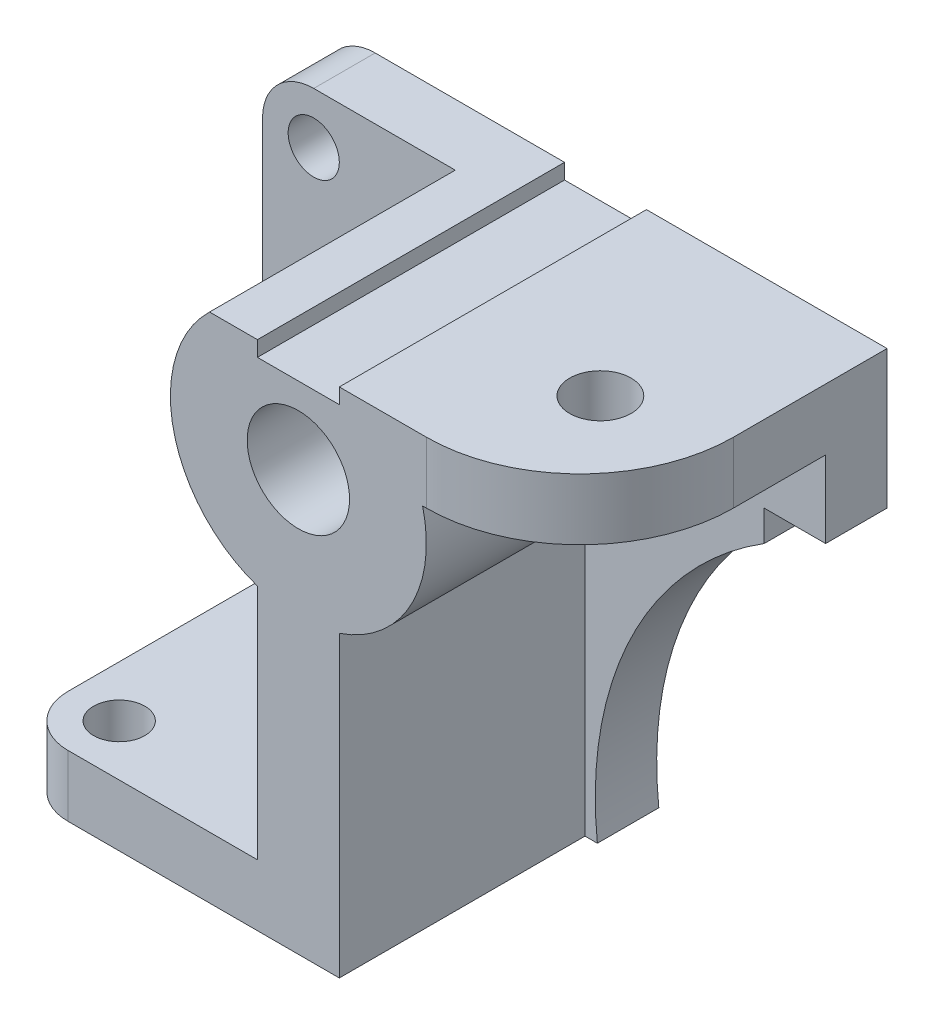
ISO-10303-21;
HEADER;
FILE_DESCRIPTION(('STEP AP214'),'2;1');
FILE_NAME('part.step','',(''),(''),'','','');
FILE_SCHEMA(('AUTOMOTIVE_DESIGN { 1 0 10303 214 1 1 1 1 }'));
ENDSEC;
DATA;
#1=APPLICATION_CONTEXT('core data for automotive mechanical design processes');
#2=APPLICATION_PROTOCOL_DEFINITION('international standard','automotive_design',2000,#1);
#3=PRODUCT_CONTEXT('',#1,'mechanical');
#4=PRODUCT('Part','Part','',(#3));
#5=PRODUCT_RELATED_PRODUCT_CATEGORY('part','',(#4));
#6=PRODUCT_DEFINITION_FORMATION('','',#4);
#7=PRODUCT_DEFINITION_CONTEXT('part definition',#1,'design');
#8=PRODUCT_DEFINITION('design','',#6,#7);
#9=PRODUCT_DEFINITION_SHAPE('','',#8);
#10=(LENGTH_UNIT() NAMED_UNIT(*) SI_UNIT(.MILLI.,.METRE.));
#11=(NAMED_UNIT(*) PLANE_ANGLE_UNIT() SI_UNIT($,.RADIAN.));
#12=(NAMED_UNIT(*) SI_UNIT($,.STERADIAN.) SOLID_ANGLE_UNIT());
#13=UNCERTAINTY_MEASURE_WITH_UNIT(LENGTH_MEASURE(1.E-05),#10,'distance_accuracy_value','');
#14=(GEOMETRIC_REPRESENTATION_CONTEXT(3) GLOBAL_UNCERTAINTY_ASSIGNED_CONTEXT((#13)) GLOBAL_UNIT_ASSIGNED_CONTEXT((#10,
#11,#12)) REPRESENTATION_CONTEXT('',''));
#15=CARTESIAN_POINT('',(0.,0.,0.));
#16=DIRECTION('',(0.,0.,1.));
#17=DIRECTION('',(1.,0.,0.));
#18=AXIS2_PLACEMENT_3D('',#15,#16,#17);
#19=CARTESIAN_POINT('',(-55.,50.,30.));
#20=DIRECTION('',(0.,-1.,0.));
#21=DIRECTION('',(0.,0.,-1.));
#22=AXIS2_PLACEMENT_3D('',#19,#20,#21);
#23=PLANE('',#22);
#24=CARTESIAN_POINT('',(35.,50.,6.));
#25=DIRECTION('',(0.,1.,0.));
#26=DIRECTION('',(0.,0.,1.));
#27=AXIS2_PLACEMENT_3D('',#24,#25,#26);
#28=CIRCLE('',#27,6.00000000000001);
#29=CARTESIAN_POINT('',(35.,50.,12.));
#30=VERTEX_POINT('',#29);
#31=EDGE_CURVE('E380',#30,#30,#28,.T.);
#32=ORIENTED_EDGE('',*,*,#31,.F.);
#33=EDGE_LOOP('',(#32));
#34=FACE_BOUND('',#33,.T.);
#35=DIRECTION('',(-1.,0.,0.));
#36=VECTOR('',#35,1.);
#37=CARTESIAN_POINT('',(-55.,50.,-30.));
#38=LINE('',#37,#36);
#39=CARTESIAN_POINT('',(55.,50.,-30.));
#40=VERTEX_POINT('',#39);
#41=CARTESIAN_POINT('',(8.,50.,-30.));
#42=VERTEX_POINT('',#41);
#43=EDGE_CURVE('E206',#40,#42,#38,.T.);
#44=ORIENTED_EDGE('',*,*,#43,.T.);
#45=DIRECTION('',(0.,0.,1.));
#46=VECTOR('',#45,1.);
#47=CARTESIAN_POINT('',(8.,50.,-30.));
#48=LINE('',#47,#46);
#49=CARTESIAN_POINT('',(8.,50.,30.));
#50=VERTEX_POINT('',#49);
#51=EDGE_CURVE('E190',#42,#50,#48,.T.);
#52=ORIENTED_EDGE('',*,*,#51,.T.);
#53=DIRECTION('',(-1.,0.,0.));
#54=VECTOR('',#53,1.);
#55=CARTESIAN_POINT('',(-55.,50.,30.));
#56=LINE('',#55,#54);
#57=CARTESIAN_POINT('',(25.,50.,30.));
#58=VERTEX_POINT('',#57);
#59=EDGE_CURVE('E253',#58,#50,#56,.T.);
#60=ORIENTED_EDGE('',*,*,#59,.F.);
#61=CARTESIAN_POINT('',(25.,50.,0.));
#62=DIRECTION('',(0.,-1.,0.));
#63=DIRECTION('',(0.,0.,-1.));
#64=AXIS2_PLACEMENT_3D('',#61,#62,#63);
#65=CIRCLE('',#64,30.);
#66=CARTESIAN_POINT('',(55.,50.,0.));
#67=VERTEX_POINT('',#66);
#68=EDGE_CURVE('E252',#58,#67,#65,.F.);
#69=ORIENTED_EDGE('',*,*,#68,.T.);
#70=DIRECTION('',(0.,0.,-1.));
#71=VECTOR('',#70,1.);
#72=CARTESIAN_POINT('',(55.,50.,30.));
#73=LINE('',#72,#71);
#74=EDGE_CURVE('E211',#67,#40,#73,.T.);
#75=ORIENTED_EDGE('',*,*,#74,.T.);
#76=EDGE_LOOP('',(#44,#52,#60,#69,#75));
#77=FACE_BOUND('',#76,.T.);
#78=ADVANCED_FACE('F41',(#34,#77),#23,.F.);
#79=CARTESIAN_POINT('',(-8.00000000000001,-38.,-18.));
#80=DIRECTION('',(0.,-1.,0.));
#81=DIRECTION('',(0.,0.,-1.));
#82=AXIS2_PLACEMENT_3D('',#79,#80,#81);
#83=PLANE('',#82);
#84=DIRECTION('',(0.,0.,1.));
#85=VECTOR('',#84,1.);
#86=CARTESIAN_POINT('',(-55.,-38.,-18.));
#87=LINE('',#86,#85);
#88=CARTESIAN_POINT('',(-55.,-38.,-18.));
#89=VERTEX_POINT('',#88);
#90=CARTESIAN_POINT('',(-55.,-38.,20.));
#91=VERTEX_POINT('',#90);
#92=EDGE_CURVE('E335',#89,#91,#87,.T.);
#93=ORIENTED_EDGE('',*,*,#92,.T.);
#94=CARTESIAN_POINT('',(-45.,-38.,20.));
#95=DIRECTION('',(0.,-1.,0.));
#96=DIRECTION('',(0.,0.,-1.));
#97=AXIS2_PLACEMENT_3D('',#94,#95,#96);
#98=CIRCLE('',#97,10.);
#99=CARTESIAN_POINT('',(-45.,-38.,30.));
#100=VERTEX_POINT('',#99);
#101=EDGE_CURVE('E247',#91,#100,#98,.F.);
#102=ORIENTED_EDGE('',*,*,#101,.T.);
#103=DIRECTION('',(1.,0.,0.));
#104=VECTOR('',#103,1.);
#105=CARTESIAN_POINT('',(-8.00000000000001,-38.,30.));
#106=LINE('',#105,#104);
#107=CARTESIAN_POINT('',(-8.00000000000001,-38.,30.));
#108=VERTEX_POINT('',#107);
#109=EDGE_CURVE('E326',#100,#108,#106,.T.);
#110=ORIENTED_EDGE('',*,*,#109,.T.);
#111=DIRECTION('',(0.,0.,1.));
#112=VECTOR('',#111,1.);
#113=CARTESIAN_POINT('',(-8.00000000000001,-38.,-18.));
#114=LINE('',#113,#112);
#115=CARTESIAN_POINT('',(-8.00000000000001,-38.,-18.));
#116=VERTEX_POINT('',#115);
#117=EDGE_CURVE('E332',#116,#108,#114,.T.);
#118=ORIENTED_EDGE('',*,*,#117,.F.);
#119=DIRECTION('',(1.,0.,0.));
#120=VECTOR('',#119,1.);
#121=CARTESIAN_POINT('',(-8.00000000000001,-38.,-18.));
#122=LINE('',#121,#120);
#123=EDGE_CURVE('E317',#89,#116,#122,.T.);
#124=ORIENTED_EDGE('',*,*,#123,.F.);
#125=EDGE_LOOP('',(#93,#102,#110,#118,#124));
#126=FACE_BOUND('',#125,.T.);
#127=CARTESIAN_POINT('',(-45.,-38.,20.));
#128=DIRECTION('',(0.,1.,0.));
#129=DIRECTION('',(0.,0.,1.));
#130=AXIS2_PLACEMENT_3D('',#127,#128,#129);
#131=CIRCLE('',#130,5.00000000000001);
#132=CARTESIAN_POINT('',(-45.,-38.,25.));
#133=VERTEX_POINT('',#132);
#134=EDGE_CURVE('E386',#133,#133,#131,.T.);
#135=ORIENTED_EDGE('',*,*,#134,.F.);
#136=EDGE_LOOP('',(#135));
#137=FACE_BOUND('',#136,.T.);
#138=ADVANCED_FACE('F466',(#126,#137),#83,.F.);
#139=CARTESIAN_POINT('',(-8.,50.,30.));
#140=VERTEX_POINT('',#139);
#141=CARTESIAN_POINT('',(-17.3493515728975,50.,30.));
#142=VERTEX_POINT('',#141);
#143=EDGE_CURVE('E225',#140,#142,#56,.T.);
#144=ORIENTED_EDGE('',*,*,#143,.F.);
#145=DIRECTION('',(0.,0.,1.));
#146=VECTOR('',#145,1.);
#147=CARTESIAN_POINT('',(-8.,50.,-30.));
#148=LINE('',#147,#146);
#149=CARTESIAN_POINT('',(-8.,50.,-30.));
#150=VERTEX_POINT('',#149);
#151=EDGE_CURVE('E200',#150,#140,#148,.T.);
#152=ORIENTED_EDGE('',*,*,#151,.F.);
#153=CARTESIAN_POINT('',(-45.,50.,-30.));
#154=VERTEX_POINT('',#153);
#155=EDGE_CURVE('E214',#150,#154,#38,.T.);
#156=ORIENTED_EDGE('',*,*,#155,.T.);
#157=DIRECTION('',(0.,0.,-1.));
#158=VECTOR('',#157,1.);
#159=CARTESIAN_POINT('',(-45.,50.,30.));
#160=LINE('',#159,#158);
#161=CARTESIAN_POINT('',(-45.,50.,-18.));
#162=VERTEX_POINT('',#161);
#163=EDGE_CURVE('E238',#154,#162,#160,.F.);
#164=ORIENTED_EDGE('',*,*,#163,.T.);
#165=DIRECTION('',(-1.,0.,0.));
#166=VECTOR('',#165,1.);
#167=CARTESIAN_POINT('',(-17.3493515728975,50.,-18.));
#168=LINE('',#167,#166);
#169=CARTESIAN_POINT('',(-17.3493515728975,50.,-18.));
#170=VERTEX_POINT('',#169);
#171=EDGE_CURVE('E311',#170,#162,#168,.T.);
#172=ORIENTED_EDGE('',*,*,#171,.F.);
#173=DIRECTION('',(0.,0.,1.));
#174=VECTOR('',#173,1.);
#175=CARTESIAN_POINT('',(-17.3493515728975,50.,-18.));
#176=LINE('',#175,#174);
#177=EDGE_CURVE('E323',#170,#142,#176,.T.);
#178=ORIENTED_EDGE('',*,*,#177,.T.);
#179=EDGE_LOOP('',(#144,#152,#156,#164,#172,#178));
#180=FACE_BOUND('',#179,.T.);
#181=ADVANCED_FACE('F414',(#180),#23,.F.);
#182=CARTESIAN_POINT('',(43.,23.,-30.));
#183=DIRECTION('',(-1.,0.,0.));
#184=DIRECTION('',(0.,0.,1.));
#185=AXIS2_PLACEMENT_3D('',#182,#183,#184);
#186=PLANE('',#185);
#187=DIRECTION('',(0.,1.,0.));
#188=VECTOR('',#187,1.);
#189=CARTESIAN_POINT('',(43.,23.,-18.));
#190=LINE('',#189,#188);
#191=CARTESIAN_POINT('',(43.,17.,-18.));
#192=VERTEX_POINT('',#191);
#193=CARTESIAN_POINT('',(43.,23.,-18.));
#194=VERTEX_POINT('',#193);
#195=EDGE_CURVE('E280',#192,#194,#190,.T.);
#196=ORIENTED_EDGE('',*,*,#195,.F.);
#197=DIRECTION('',(0.,0.,1.));
#198=VECTOR('',#197,1.);
#199=CARTESIAN_POINT('',(43.,17.,-30.));
#200=LINE('',#199,#198);
#201=CARTESIAN_POINT('',(43.,17.,-30.));
#202=VERTEX_POINT('',#201);
#203=EDGE_CURVE('E299',#202,#192,#200,.T.);
#204=ORIENTED_EDGE('',*,*,#203,.F.);
#205=DIRECTION('',(0.,-1.,0.));
#206=VECTOR('',#205,1.);
#207=CARTESIAN_POINT('',(43.,23.,-30.));
#208=LINE('',#207,#206);
#209=CARTESIAN_POINT('',(43.,23.,-30.));
#210=VERTEX_POINT('',#209);
#211=EDGE_CURVE('E289',#210,#202,#208,.T.);
#212=ORIENTED_EDGE('',*,*,#211,.F.);
#213=DIRECTION('',(0.,0.,1.));
#214=VECTOR('',#213,1.);
#215=CARTESIAN_POINT('',(43.,23.,-30.));
#216=LINE('',#215,#214);
#217=EDGE_CURVE('E300',#210,#194,#216,.T.);
#218=ORIENTED_EDGE('',*,*,#217,.T.);
#219=EDGE_LOOP('',(#196,#204,#212,#218));
#220=FACE_BOUND('',#219,.T.);
#221=ADVANCED_FACE('F445',(#220),#186,.F.);
#222=CARTESIAN_POINT('',(43.,23.,-30.));
#223=DIRECTION('',(0.,-1.,0.));
#224=DIRECTION('',(0.,0.,-1.));
#225=AXIS2_PLACEMENT_3D('',#222,#223,#224);
#226=PLANE('',#225);
#227=DIRECTION('',(0.,0.,1.));
#228=VECTOR('',#227,1.);
#229=CARTESIAN_POINT('',(55.,23.,-30.));
#230=LINE('',#229,#228);
#231=CARTESIAN_POINT('',(55.,23.,-30.));
#232=VERTEX_POINT('',#231);
#233=CARTESIAN_POINT('',(55.,23.,-18.));
#234=VERTEX_POINT('',#233);
#235=EDGE_CURVE('E304',#232,#234,#230,.T.);
#236=ORIENTED_EDGE('',*,*,#235,.T.);
#237=DIRECTION('',(1.,0.,0.));
#238=VECTOR('',#237,1.);
#239=CARTESIAN_POINT('',(43.,23.,-18.));
#240=LINE('',#239,#238);
#241=EDGE_CURVE('E285',#194,#234,#240,.T.);
#242=ORIENTED_EDGE('',*,*,#241,.F.);
#243=ORIENTED_EDGE('',*,*,#217,.F.);
#244=DIRECTION('',(1.,0.,0.));
#245=VECTOR('',#244,1.);
#246=CARTESIAN_POINT('',(43.,23.,-30.));
#247=LINE('',#246,#245);
#248=EDGE_CURVE('E297',#210,#232,#247,.T.);
#249=ORIENTED_EDGE('',*,*,#248,.T.);
#250=EDGE_LOOP('',(#236,#242,#243,#249));
#251=FACE_BOUND('',#250,.T.);
#252=ADVANCED_FACE('F450',(#251),#226,.T.);
#253=CARTESIAN_POINT('',(55.,50.,30.));
#254=DIRECTION('',(-1.,0.,0.));
#255=DIRECTION('',(0.,-1.,0.));
#256=AXIS2_PLACEMENT_3D('',#253,#254,#255);
#257=PLANE('',#256);
#258=ORIENTED_EDGE('',*,*,#74,.F.);
#259=DIRECTION('',(0.,1.,0.));
#260=VECTOR('',#259,1.);
#261=CARTESIAN_POINT('',(55.,38.,0.));
#262=LINE('',#261,#260);
#263=CARTESIAN_POINT('',(55.,38.,0.));
#264=VERTEX_POINT('',#263);
#265=EDGE_CURVE('E49',#67,#264,#262,.F.);
#266=ORIENTED_EDGE('',*,*,#265,.T.);
#267=DIRECTION('',(0.,0.,1.));
#268=VECTOR('',#267,1.);
#269=CARTESIAN_POINT('',(55.,38.,-18.));
#270=LINE('',#269,#268);
#271=CARTESIAN_POINT('',(55.,38.,-18.));
#272=VERTEX_POINT('',#271);
#273=EDGE_CURVE('E264',#272,#264,#270,.T.);
#274=ORIENTED_EDGE('',*,*,#273,.F.);
#275=DIRECTION('',(0.,1.,0.));
#276=VECTOR('',#275,1.);
#277=CARTESIAN_POINT('',(55.,23.,-18.));
#278=LINE('',#277,#276);
#279=EDGE_CURVE('E365',#234,#272,#278,.T.);
#280=ORIENTED_EDGE('',*,*,#279,.F.);
#281=ORIENTED_EDGE('',*,*,#235,.F.);
#282=DIRECTION('',(0.,1.,0.));
#283=VECTOR('',#282,1.);
#284=CARTESIAN_POINT('',(55.,50.,-30.));
#285=LINE('',#284,#283);
#286=EDGE_CURVE('E219',#232,#40,#285,.T.);
#287=ORIENTED_EDGE('',*,*,#286,.T.);
#288=EDGE_LOOP('',(#258,#266,#274,#280,#281,#287));
#289=FACE_BOUND('',#288,.T.);
#290=ADVANCED_FACE('F256',(#289),#257,.F.);
#291=CARTESIAN_POINT('',(0.,0.,30.));
#292=DIRECTION('',(0.,0.,1.));
#293=DIRECTION('',(1.,0.,0.));
#294=AXIS2_PLACEMENT_3D('',#291,#292,#293);
#295=PLANE('',#294);
#296=DIRECTION('',(0.,1.,0.));
#297=VECTOR('',#296,1.);
#298=CARTESIAN_POINT('',(8.,47.,30.));
#299=LINE('',#298,#297);
#300=CARTESIAN_POINT('',(8.,47.,30.));
#301=VERTEX_POINT('',#300);
#302=EDGE_CURVE('E195',#301,#50,#299,.T.);
#303=ORIENTED_EDGE('',*,*,#302,.F.);
#304=DIRECTION('',(1.,0.,0.));
#305=VECTOR('',#304,1.);
#306=CARTESIAN_POINT('',(-8.,47.,30.));
#307=LINE('',#306,#305);
#308=CARTESIAN_POINT('',(-8.,47.,30.));
#309=VERTEX_POINT('',#308);
#310=EDGE_CURVE('E209',#309,#301,#307,.T.);
#311=ORIENTED_EDGE('',*,*,#310,.F.);
#312=DIRECTION('',(0.,-1.,0.));
#313=VECTOR('',#312,1.);
#314=CARTESIAN_POINT('',(-8.,47.,30.));
#315=LINE('',#314,#313);
#316=EDGE_CURVE('E402',#140,#309,#315,.T.);
#317=ORIENTED_EDGE('',*,*,#316,.F.);
#318=ORIENTED_EDGE('',*,*,#143,.T.);
#319=CARTESIAN_POINT('',(0.,32.,30.));
#320=DIRECTION('',(0.,0.,-1.));
#321=DIRECTION('',(1.,0.,0.));
#322=AXIS2_PLACEMENT_3D('',#319,#320,#321);
#323=CIRCLE('',#322,25.);
#324=CARTESIAN_POINT('',(-8.00000000000002,8.31456143534599,30.));
#325=VERTEX_POINT('',#324);
#326=EDGE_CURVE('E303',#325,#142,#323,.T.);
#327=ORIENTED_EDGE('',*,*,#326,.F.);
#328=DIRECTION('',(0.,1.,0.));
#329=VECTOR('',#328,1.);
#330=CARTESIAN_POINT('',(-8.00000000000002,8.31456143534599,30.));
#331=LINE('',#330,#329);
#332=EDGE_CURVE('E312',#108,#325,#331,.T.);
#333=ORIENTED_EDGE('',*,*,#332,.F.);
#334=ORIENTED_EDGE('',*,*,#109,.F.);
#335=DIRECTION('',(0.,-1.,0.));
#336=VECTOR('',#335,1.);
#337=CARTESIAN_POINT('',(-45.,-50.,30.));
#338=LINE('',#337,#336);
#339=CARTESIAN_POINT('',(-45.,-50.,30.));
#340=VERTEX_POINT('',#339);
#341=EDGE_CURVE('E242',#100,#340,#338,.T.);
#342=ORIENTED_EDGE('',*,*,#341,.T.);
#343=DIRECTION('',(1.,0.,0.));
#344=VECTOR('',#343,1.);
#345=CARTESIAN_POINT('',(-55.,-50.,30.));
#346=LINE('',#345,#344);
#347=CARTESIAN_POINT('',(8.00000000000002,-50.,30.));
#348=VERTEX_POINT('',#347);
#349=EDGE_CURVE('E228',#340,#348,#346,.T.);
#350=ORIENTED_EDGE('',*,*,#349,.T.);
#351=DIRECTION('',(0.,-1.,0.));
#352=VECTOR('',#351,1.);
#353=CARTESIAN_POINT('',(8.00000000000002,8.31456143534599,30.));
#354=LINE('',#353,#352);
#355=CARTESIAN_POINT('',(8.00000000000002,8.31456143534599,30.));
#356=VERTEX_POINT('',#355);
#357=EDGE_CURVE('E274',#356,#348,#354,.T.);
#358=ORIENTED_EDGE('',*,*,#357,.F.);
#359=CARTESIAN_POINT('',(0.,32.,30.));
#360=DIRECTION('',(0.,0.,-1.));
#361=DIRECTION('',(1.,0.,0.));
#362=AXIS2_PLACEMENT_3D('',#359,#360,#361);
#363=CIRCLE('',#362,25.);
#364=CARTESIAN_POINT('',(24.2693221990232,38.,30.));
#365=VERTEX_POINT('',#364);
#366=EDGE_CURVE('E271',#365,#356,#363,.T.);
#367=ORIENTED_EDGE('',*,*,#366,.F.);
#368=DIRECTION('',(-1.,0.,0.));
#369=VECTOR('',#368,1.);
#370=CARTESIAN_POINT('',(24.2693221990232,38.,30.));
#371=LINE('',#370,#369);
#372=CARTESIAN_POINT('',(25.,38.,30.));
#373=VERTEX_POINT('',#372);
#374=EDGE_CURVE('E262',#373,#365,#371,.T.);
#375=ORIENTED_EDGE('',*,*,#374,.F.);
#376=DIRECTION('',(0.,1.,0.));
#377=VECTOR('',#376,1.);
#378=CARTESIAN_POINT('',(25.,50.,30.));
#379=LINE('',#378,#377);
#380=EDGE_CURVE('E249',#373,#58,#379,.T.);
#381=ORIENTED_EDGE('',*,*,#380,.T.);
#382=ORIENTED_EDGE('',*,*,#59,.T.);
#383=EDGE_LOOP('',(#303,#311,#317,#318,#327,#333,#334,#342,#350,#358,#367,#375,#381,#382));
#384=FACE_BOUND('',#383,.T.);
#385=CARTESIAN_POINT('',(0.,32.,30.));
#386=DIRECTION('',(0.,0.,1.));
#387=DIRECTION('',(1.,0.,0.));
#388=AXIS2_PLACEMENT_3D('',#385,#386,#387);
#389=CIRCLE('',#388,10.);
#390=CARTESIAN_POINT('',(10.,32.,30.));
#391=VERTEX_POINT('',#390);
#392=EDGE_CURVE('E374',#391,#391,#389,.T.);
#393=ORIENTED_EDGE('',*,*,#392,.F.);
#394=EDGE_LOOP('',(#393));
#395=FACE_BOUND('',#394,.T.);
#396=ADVANCED_FACE('F267',(#384,#395),#295,.T.);
#397=CARTESIAN_POINT('',(0.,0.,-30.));
#398=DIRECTION('',(0.,0.,1.));
#399=DIRECTION('',(1.,0.,0.));
#400=AXIS2_PLACEMENT_3D('',#397,#398,#399);
#401=PLANE('',#400);
#402=CARTESIAN_POINT('',(-45.,40.,-30.));
#403=DIRECTION('',(0.,0.,1.));
#404=DIRECTION('',(1.,0.,0.));
#405=AXIS2_PLACEMENT_3D('',#402,#403,#404);
#406=CIRCLE('',#405,5.00000000000001);
#407=CARTESIAN_POINT('',(-40.,40.,-30.));
#408=VERTEX_POINT('',#407);
#409=EDGE_CURVE('E389',#408,#408,#406,.T.);
#410=ORIENTED_EDGE('',*,*,#409,.T.);
#411=EDGE_LOOP('',(#410));
#412=FACE_BOUND('',#411,.T.);
#413=CARTESIAN_POINT('',(0.,32.,-30.));
#414=DIRECTION('',(0.,0.,1.));
#415=DIRECTION('',(1.,0.,0.));
#416=AXIS2_PLACEMENT_3D('',#413,#414,#415);
#417=CIRCLE('',#416,10.);
#418=CARTESIAN_POINT('',(10.,32.,-30.));
#419=VERTEX_POINT('',#418);
#420=EDGE_CURVE('E371',#419,#419,#417,.T.);
#421=ORIENTED_EDGE('',*,*,#420,.T.);
#422=EDGE_LOOP('',(#421));
#423=FACE_BOUND('',#422,.T.);
#424=DIRECTION('',(1.,0.,0.));
#425=VECTOR('',#424,1.);
#426=CARTESIAN_POINT('',(-8.,47.,-30.));
#427=LINE('',#426,#425);
#428=CARTESIAN_POINT('',(-8.,47.,-30.));
#429=VERTEX_POINT('',#428);
#430=CARTESIAN_POINT('',(8.,47.,-30.));
#431=VERTEX_POINT('',#430);
#432=EDGE_CURVE('E56',#429,#431,#427,.T.);
#433=ORIENTED_EDGE('',*,*,#432,.T.);
#434=DIRECTION('',(0.,1.,0.));
#435=VECTOR('',#434,1.);
#436=CARTESIAN_POINT('',(8.,47.,-30.));
#437=LINE('',#436,#435);
#438=EDGE_CURVE('E193',#431,#42,#437,.T.);
#439=ORIENTED_EDGE('',*,*,#438,.T.);
#440=ORIENTED_EDGE('',*,*,#43,.F.);
#441=ORIENTED_EDGE('',*,*,#286,.F.);
#442=ORIENTED_EDGE('',*,*,#248,.F.);
#443=ORIENTED_EDGE('',*,*,#211,.T.);
#444=CARTESIAN_POINT('',(80.,-42.4222180669823,-30.));
#445=DIRECTION('',(0.,0.,1.));
#446=DIRECTION('',(1.,0.,0.));
#447=AXIS2_PLACEMENT_3D('',#444,#445,#446);
#448=CIRCLE('',#447,70.);
#449=CARTESIAN_POINT('',(10.4113714679213,-50.,-30.));
#450=VERTEX_POINT('',#449);
#451=EDGE_CURVE('E277',#202,#450,#448,.T.);
#452=ORIENTED_EDGE('',*,*,#451,.T.);
#453=DIRECTION('',(1.,0.,0.));
#454=VECTOR('',#453,1.);
#455=CARTESIAN_POINT('',(-55.,-50.,-30.));
#456=LINE('',#455,#454);
#457=CARTESIAN_POINT('',(-55.,-50.,-30.));
#458=VERTEX_POINT('',#457);
#459=EDGE_CURVE('E217',#458,#450,#456,.T.);
#460=ORIENTED_EDGE('',*,*,#459,.F.);
#461=DIRECTION('',(0.,-1.,0.));
#462=VECTOR('',#461,1.);
#463=CARTESIAN_POINT('',(-55.,50.,-30.));
#464=LINE('',#463,#462);
#465=CARTESIAN_POINT('',(-55.,40.,-30.));
#466=VERTEX_POINT('',#465);
#467=EDGE_CURVE('E213',#466,#458,#464,.T.);
#468=ORIENTED_EDGE('',*,*,#467,.F.);
#469=CARTESIAN_POINT('',(-45.,40.,-30.));
#470=DIRECTION('',(0.,0.,1.));
#471=DIRECTION('',(1.,0.,0.));
#472=AXIS2_PLACEMENT_3D('',#469,#470,#471);
#473=CIRCLE('',#472,10.);
#474=EDGE_CURVE('E235',#466,#154,#473,.F.);
#475=ORIENTED_EDGE('',*,*,#474,.T.);
#476=ORIENTED_EDGE('',*,*,#155,.F.);
#477=DIRECTION('',(0.,-1.,0.));
#478=VECTOR('',#477,1.);
#479=CARTESIAN_POINT('',(-8.,47.,-30.));
#480=LINE('',#479,#478);
#481=EDGE_CURVE('E208',#150,#429,#480,.T.);
#482=ORIENTED_EDGE('',*,*,#481,.T.);
#483=EDGE_LOOP('',(#433,#439,#440,#441,#442,#443,#452,#460,#468,#475,#476,#482));
#484=FACE_BOUND('',#483,.T.);
#485=ADVANCED_FACE('F204',(#412,#423,#484),#401,.F.);
#486=CARTESIAN_POINT('',(-55.,50.,30.));
#487=DIRECTION('',(1.,0.,0.));
#488=DIRECTION('',(0.,1.,0.));
#489=AXIS2_PLACEMENT_3D('',#486,#487,#488);
#490=PLANE('',#489);
#491=DIRECTION('',(0.,-1.,0.));
#492=VECTOR('',#491,1.);
#493=CARTESIAN_POINT('',(-55.,50.,-18.));
#494=LINE('',#493,#492);
#495=CARTESIAN_POINT('',(-55.,40.,-18.));
#496=VERTEX_POINT('',#495);
#497=EDGE_CURVE('E315',#496,#89,#494,.T.);
#498=ORIENTED_EDGE('',*,*,#497,.F.);
#499=DIRECTION('',(0.,0.,-1.));
#500=VECTOR('',#499,1.);
#501=CARTESIAN_POINT('',(-55.,40.,30.));
#502=LINE('',#501,#500);
#503=EDGE_CURVE('E232',#496,#466,#502,.T.);
#504=ORIENTED_EDGE('',*,*,#503,.T.);
#505=ORIENTED_EDGE('',*,*,#467,.T.);
#506=DIRECTION('',(0.,0.,-1.));
#507=VECTOR('',#506,1.);
#508=CARTESIAN_POINT('',(-55.,-50.,30.));
#509=LINE('',#508,#507);
#510=CARTESIAN_POINT('',(-55.,-50.,20.));
#511=VERTEX_POINT('',#510);
#512=EDGE_CURVE('E226',#511,#458,#509,.T.);
#513=ORIENTED_EDGE('',*,*,#512,.F.);
#514=DIRECTION('',(0.,-1.,0.));
#515=VECTOR('',#514,1.);
#516=CARTESIAN_POINT('',(-55.,-38.,20.));
#517=LINE('',#516,#515);
#518=EDGE_CURVE('E230',#511,#91,#517,.F.);
#519=ORIENTED_EDGE('',*,*,#518,.T.);
#520=ORIENTED_EDGE('',*,*,#92,.F.);
#521=EDGE_LOOP('',(#498,#504,#505,#513,#519,#520));
#522=FACE_BOUND('',#521,.T.);
#523=ADVANCED_FACE('F433',(#522),#490,.F.);
#524=CARTESIAN_POINT('',(-55.,-50.,30.));
#525=DIRECTION('',(0.,1.,0.));
#526=DIRECTION('',(0.,0.,1.));
#527=AXIS2_PLACEMENT_3D('',#524,#525,#526);
#528=PLANE('',#527);
#529=CARTESIAN_POINT('',(-45.,-50.,20.));
#530=DIRECTION('',(0.,1.,0.));
#531=DIRECTION('',(0.,0.,1.));
#532=AXIS2_PLACEMENT_3D('',#529,#530,#531);
#533=CIRCLE('',#532,5.00000000000001);
#534=CARTESIAN_POINT('',(-45.,-50.,25.));
#535=VERTEX_POINT('',#534);
#536=EDGE_CURVE('E383',#535,#535,#533,.T.);
#537=ORIENTED_EDGE('',*,*,#536,.T.);
#538=EDGE_LOOP('',(#537));
#539=FACE_BOUND('',#538,.T.);
#540=ORIENTED_EDGE('',*,*,#349,.F.);
#541=CARTESIAN_POINT('',(-45.,-50.,20.));
#542=DIRECTION('',(0.,1.,0.));
#543=DIRECTION('',(0.,0.,1.));
#544=AXIS2_PLACEMENT_3D('',#541,#542,#543);
#545=CIRCLE('',#544,10.);
#546=EDGE_CURVE('E245',#340,#511,#545,.F.);
#547=ORIENTED_EDGE('',*,*,#546,.T.);
#548=ORIENTED_EDGE('',*,*,#512,.T.);
#549=ORIENTED_EDGE('',*,*,#459,.T.);
#550=DIRECTION('',(0.,0.,1.));
#551=VECTOR('',#550,1.);
#552=CARTESIAN_POINT('',(10.4113714679213,-50.,-30.));
#553=LINE('',#552,#551);
#554=CARTESIAN_POINT('',(10.4113714679213,-50.,-18.));
#555=VERTEX_POINT('',#554);
#556=EDGE_CURVE('E272',#450,#555,#553,.T.);
#557=ORIENTED_EDGE('',*,*,#556,.T.);
#558=DIRECTION('',(1.,0.,0.));
#559=VECTOR('',#558,1.);
#560=CARTESIAN_POINT('',(8.00000000000002,-50.,-18.));
#561=LINE('',#560,#559);
#562=CARTESIAN_POINT('',(8.00000000000002,-50.,-18.));
#563=VERTEX_POINT('',#562);
#564=EDGE_CURVE('E351',#563,#555,#561,.T.);
#565=ORIENTED_EDGE('',*,*,#564,.F.);
#566=DIRECTION('',(0.,0.,1.));
#567=VECTOR('',#566,1.);
#568=CARTESIAN_POINT('',(8.00000000000002,-50.,-18.));
#569=LINE('',#568,#567);
#570=EDGE_CURVE('E286',#563,#348,#569,.T.);
#571=ORIENTED_EDGE('',*,*,#570,.T.);
#572=EDGE_LOOP('',(#540,#547,#548,#549,#557,#565,#571));
#573=FACE_BOUND('',#572,.T.);
#574=ADVANCED_FACE('F349',(#539,#573),#528,.F.);
#575=CARTESIAN_POINT('',(0.,32.,-18.));
#576=DIRECTION('',(0.,0.,1.));
#577=DIRECTION('',(1.,0.,0.));
#578=AXIS2_PLACEMENT_3D('',#575,#576,#577);
#579=CYLINDRICAL_SURFACE('',#578,25.);
#580=ORIENTED_EDGE('',*,*,#326,.T.);
#581=ORIENTED_EDGE('',*,*,#177,.F.);
#582=CARTESIAN_POINT('',(0.,32.,-18.));
#583=DIRECTION('',(0.,0.,-1.));
#584=DIRECTION('',(1.,0.,0.));
#585=AXIS2_PLACEMENT_3D('',#582,#583,#584);
#586=CIRCLE('',#585,25.);
#587=CARTESIAN_POINT('',(-8.00000000000002,8.31456143534599,-18.));
#588=VERTEX_POINT('',#587);
#589=EDGE_CURVE('E308',#588,#170,#586,.T.);
#590=ORIENTED_EDGE('',*,*,#589,.F.);
#591=DIRECTION('',(0.,0.,1.));
#592=VECTOR('',#591,1.);
#593=CARTESIAN_POINT('',(-8.00000000000002,8.31456143534599,-18.));
#594=LINE('',#593,#592);
#595=EDGE_CURVE('E330',#588,#325,#594,.T.);
#596=ORIENTED_EDGE('',*,*,#595,.T.);
#597=EDGE_LOOP('',(#580,#581,#590,#596));
#598=FACE_BOUND('',#597,.T.);
#599=ADVANCED_FACE('F420',(#598),#579,.T.);
#600=CARTESIAN_POINT('',(-8.00000000000002,8.31456143534599,-18.));
#601=DIRECTION('',(1.,0.,0.));
#602=DIRECTION('',(0.,1.,0.));
#603=AXIS2_PLACEMENT_3D('',#600,#601,#602);
#604=PLANE('',#603);
#605=ORIENTED_EDGE('',*,*,#332,.T.);
#606=ORIENTED_EDGE('',*,*,#595,.F.);
#607=DIRECTION('',(0.,1.,0.));
#608=VECTOR('',#607,1.);
#609=CARTESIAN_POINT('',(-8.00000000000002,8.31456143534599,-18.));
#610=LINE('',#609,#608);
#611=EDGE_CURVE('E320',#116,#588,#610,.T.);
#612=ORIENTED_EDGE('',*,*,#611,.F.);
#613=ORIENTED_EDGE('',*,*,#117,.T.);
#614=EDGE_LOOP('',(#605,#606,#612,#613));
#615=FACE_BOUND('',#614,.T.);
#616=ADVANCED_FACE('F424',(#615),#604,.F.);
#617=CARTESIAN_POINT('',(0.,32.,-18.));
#618=DIRECTION('',(0.,0.,1.));
#619=DIRECTION('',(1.,0.,0.));
#620=AXIS2_PLACEMENT_3D('',#617,#618,#619);
#621=PLANE('',#620);
#622=CARTESIAN_POINT('',(-45.,40.,-18.));
#623=DIRECTION('',(0.,0.,1.));
#624=DIRECTION('',(1.,0.,0.));
#625=AXIS2_PLACEMENT_3D('',#622,#623,#624);
#626=CIRCLE('',#625,5.00000000000001);
#627=CARTESIAN_POINT('',(-40.,40.,-18.));
#628=VERTEX_POINT('',#627);
#629=EDGE_CURVE('E392',#628,#628,#626,.T.);
#630=ORIENTED_EDGE('',*,*,#629,.F.);
#631=EDGE_LOOP('',(#630));
#632=FACE_BOUND('',#631,.T.);
#633=ORIENTED_EDGE('',*,*,#171,.T.);
#634=CARTESIAN_POINT('',(-45.,40.,-18.));
#635=DIRECTION('',(0.,0.,1.));
#636=DIRECTION('',(1.,0.,0.));
#637=AXIS2_PLACEMENT_3D('',#634,#635,#636);
#638=CIRCLE('',#637,10.);
#639=EDGE_CURVE('E240',#162,#496,#638,.T.);
#640=ORIENTED_EDGE('',*,*,#639,.T.);
#641=ORIENTED_EDGE('',*,*,#497,.T.);
#642=ORIENTED_EDGE('',*,*,#123,.T.);
#643=ORIENTED_EDGE('',*,*,#611,.T.);
#644=ORIENTED_EDGE('',*,*,#589,.T.);
#645=EDGE_LOOP('',(#633,#640,#641,#642,#643,#644));
#646=FACE_BOUND('',#645,.T.);
#647=ADVANCED_FACE('F463',(#632,#646),#621,.T.);
#648=CARTESIAN_POINT('',(8.00000000000002,8.31456143534599,-18.));
#649=DIRECTION('',(-1.,0.,0.));
#650=DIRECTION('',(0.,0.,1.));
#651=AXIS2_PLACEMENT_3D('',#648,#649,#650);
#652=PLANE('',#651);
#653=ORIENTED_EDGE('',*,*,#357,.T.);
#654=ORIENTED_EDGE('',*,*,#570,.F.);
#655=DIRECTION('',(0.,-1.,0.));
#656=VECTOR('',#655,1.);
#657=CARTESIAN_POINT('',(8.00000000000002,8.31456143534599,-18.));
#658=LINE('',#657,#656);
#659=CARTESIAN_POINT('',(8.00000000000002,8.31456143534599,-18.));
#660=VERTEX_POINT('',#659);
#661=EDGE_CURVE('E355',#660,#563,#658,.T.);
#662=ORIENTED_EDGE('',*,*,#661,.F.);
#663=DIRECTION('',(0.,0.,1.));
#664=VECTOR('',#663,1.);
#665=CARTESIAN_POINT('',(8.00000000000002,8.31456143534599,-18.));
#666=LINE('',#665,#664);
#667=EDGE_CURVE('E290',#660,#356,#666,.T.);
#668=ORIENTED_EDGE('',*,*,#667,.T.);
#669=EDGE_LOOP('',(#653,#654,#662,#668));
#670=FACE_BOUND('',#669,.T.);
#671=ADVANCED_FACE('F345',(#670),#652,.F.);
#672=CARTESIAN_POINT('',(0.,32.,-18.));
#673=DIRECTION('',(0.,0.,1.));
#674=DIRECTION('',(1.,0.,0.));
#675=AXIS2_PLACEMENT_3D('',#672,#673,#674);
#676=CYLINDRICAL_SURFACE('',#675,25.);
#677=ORIENTED_EDGE('',*,*,#366,.T.);
#678=ORIENTED_EDGE('',*,*,#667,.F.);
#679=CARTESIAN_POINT('',(0.,32.,-18.));
#680=DIRECTION('',(0.,0.,-1.));
#681=DIRECTION('',(1.,0.,0.));
#682=AXIS2_PLACEMENT_3D('',#679,#680,#681);
#683=CIRCLE('',#682,25.);
#684=CARTESIAN_POINT('',(24.2693221990232,38.,-18.));
#685=VERTEX_POINT('',#684);
#686=EDGE_CURVE('E357',#685,#660,#683,.T.);
#687=ORIENTED_EDGE('',*,*,#686,.F.);
#688=DIRECTION('',(0.,0.,1.));
#689=VECTOR('',#688,1.);
#690=CARTESIAN_POINT('',(24.2693221990232,38.,-18.));
#691=LINE('',#690,#689);
#692=EDGE_CURVE('E292',#685,#365,#691,.T.);
#693=ORIENTED_EDGE('',*,*,#692,.T.);
#694=EDGE_LOOP('',(#677,#678,#687,#693));
#695=FACE_BOUND('',#694,.T.);
#696=ADVANCED_FACE('F453',(#695),#676,.T.);
#697=CARTESIAN_POINT('',(24.2693221990232,38.,-18.));
#698=DIRECTION('',(0.,1.,0.));
#699=DIRECTION('',(0.,0.,1.));
#700=AXIS2_PLACEMENT_3D('',#697,#698,#699);
#701=PLANE('',#700);
#702=CARTESIAN_POINT('',(35.,38.,6.));
#703=DIRECTION('',(0.,1.,0.));
#704=DIRECTION('',(0.,0.,1.));
#705=AXIS2_PLACEMENT_3D('',#702,#703,#704);
#706=CIRCLE('',#705,6.00000000000001);
#707=CARTESIAN_POINT('',(35.,38.,12.));
#708=VERTEX_POINT('',#707);
#709=EDGE_CURVE('E377',#708,#708,#706,.T.);
#710=ORIENTED_EDGE('',*,*,#709,.T.);
#711=EDGE_LOOP('',(#710));
#712=FACE_BOUND('',#711,.T.);
#713=ORIENTED_EDGE('',*,*,#273,.T.);
#714=CARTESIAN_POINT('',(25.,38.,0.));
#715=DIRECTION('',(0.,1.,0.));
#716=DIRECTION('',(0.,0.,1.));
#717=AXIS2_PLACEMENT_3D('',#714,#715,#716);
#718=CIRCLE('',#717,30.);
#719=EDGE_CURVE('E11',#264,#373,#718,.F.);
#720=ORIENTED_EDGE('',*,*,#719,.T.);
#721=ORIENTED_EDGE('',*,*,#374,.T.);
#722=ORIENTED_EDGE('',*,*,#692,.F.);
#723=DIRECTION('',(-1.,0.,0.));
#724=VECTOR('',#723,1.);
#725=CARTESIAN_POINT('',(24.2693221990232,38.,-18.));
#726=LINE('',#725,#724);
#727=EDGE_CURVE('E362',#272,#685,#726,.T.);
#728=ORIENTED_EDGE('',*,*,#727,.F.);
#729=EDGE_LOOP('',(#713,#720,#721,#722,#728));
#730=FACE_BOUND('',#729,.T.);
#731=ADVANCED_FACE('F261',(#712,#730),#701,.F.);
#732=CARTESIAN_POINT('',(0.,32.,-18.));
#733=DIRECTION('',(0.,0.,1.));
#734=DIRECTION('',(1.,0.,0.));
#735=AXIS2_PLACEMENT_3D('',#732,#733,#734);
#736=PLANE('',#735);
#737=ORIENTED_EDGE('',*,*,#241,.T.);
#738=ORIENTED_EDGE('',*,*,#279,.T.);
#739=ORIENTED_EDGE('',*,*,#727,.T.);
#740=ORIENTED_EDGE('',*,*,#686,.T.);
#741=ORIENTED_EDGE('',*,*,#661,.T.);
#742=ORIENTED_EDGE('',*,*,#564,.T.);
#743=CARTESIAN_POINT('',(80.,-42.4222180669823,-18.));
#744=DIRECTION('',(0.,0.,-1.));
#745=DIRECTION('',(1.,0.,0.));
#746=AXIS2_PLACEMENT_3D('',#743,#744,#745);
#747=CIRCLE('',#746,70.);
#748=EDGE_CURVE('E354',#555,#192,#747,.T.);
#749=ORIENTED_EDGE('',*,*,#748,.T.);
#750=ORIENTED_EDGE('',*,*,#195,.T.);
#751=EDGE_LOOP('',(#737,#738,#739,#740,#741,#742,#749,#750));
#752=FACE_BOUND('',#751,.T.);
#753=ADVANCED_FACE('F447',(#752),#736,.T.);
#754=CARTESIAN_POINT('',(80.,-42.4222180669823,-30.));
#755=DIRECTION('',(0.,0.,1.));
#756=DIRECTION('',(1.,0.,0.));
#757=AXIS2_PLACEMENT_3D('',#754,#755,#756);
#758=CYLINDRICAL_SURFACE('',#757,70.);
#759=ORIENTED_EDGE('',*,*,#748,.F.);
#760=ORIENTED_EDGE('',*,*,#556,.F.);
#761=ORIENTED_EDGE('',*,*,#451,.F.);
#762=ORIENTED_EDGE('',*,*,#203,.T.);
#763=EDGE_LOOP('',(#759,#760,#761,#762));
#764=FACE_BOUND('',#763,.T.);
#765=ADVANCED_FACE('F442',(#764),#758,.F.);
#766=CARTESIAN_POINT('',(0.,32.,30.));
#767=DIRECTION('',(0.,0.,1.));
#768=DIRECTION('',(1.,0.,0.));
#769=AXIS2_PLACEMENT_3D('',#766,#767,#768);
#770=CYLINDRICAL_SURFACE('',#769,10.);
#771=ORIENTED_EDGE('',*,*,#420,.F.);
#772=EDGE_LOOP('',(#771));
#773=FACE_BOUND('',#772,.T.);
#774=ORIENTED_EDGE('',*,*,#392,.T.);
#775=EDGE_LOOP('',(#774));
#776=FACE_BOUND('',#775,.T.);
#777=ADVANCED_FACE('F510',(#773,#776),#770,.F.);
#778=CARTESIAN_POINT('',(-45.,40.,30.));
#779=DIRECTION('',(0.,0.,-1.));
#780=DIRECTION('',(-1.,0.,0.));
#781=AXIS2_PLACEMENT_3D('',#778,#779,#780);
#782=CYLINDRICAL_SURFACE('',#781,10.);
#783=ORIENTED_EDGE('',*,*,#639,.F.);
#784=ORIENTED_EDGE('',*,*,#163,.F.);
#785=ORIENTED_EDGE('',*,*,#474,.F.);
#786=ORIENTED_EDGE('',*,*,#503,.F.);
#787=EDGE_LOOP('',(#783,#784,#785,#786));
#788=FACE_BOUND('',#787,.T.);
#789=ADVANCED_FACE('F514',(#788),#782,.T.);
#790=CARTESIAN_POINT('',(-45.,0.,20.));
#791=DIRECTION('',(0.,1.,0.));
#792=DIRECTION('',(-1.,0.,0.));
#793=AXIS2_PLACEMENT_3D('',#790,#791,#792);
#794=CYLINDRICAL_SURFACE('',#793,10.);
#795=ORIENTED_EDGE('',*,*,#101,.F.);
#796=ORIENTED_EDGE('',*,*,#518,.F.);
#797=ORIENTED_EDGE('',*,*,#546,.F.);
#798=ORIENTED_EDGE('',*,*,#341,.F.);
#799=EDGE_LOOP('',(#795,#796,#797,#798));
#800=FACE_BOUND('',#799,.T.);
#801=ADVANCED_FACE('F428',(#800),#794,.T.);
#802=CARTESIAN_POINT('',(25.,0.,0.));
#803=DIRECTION('',(0.,-1.,0.));
#804=DIRECTION('',(1.,0.,0.));
#805=AXIS2_PLACEMENT_3D('',#802,#803,#804);
#806=CYLINDRICAL_SURFACE('',#805,30.);
#807=ORIENTED_EDGE('',*,*,#719,.F.);
#808=ORIENTED_EDGE('',*,*,#265,.F.);
#809=ORIENTED_EDGE('',*,*,#68,.F.);
#810=ORIENTED_EDGE('',*,*,#380,.F.);
#811=EDGE_LOOP('',(#807,#808,#809,#810));
#812=FACE_BOUND('',#811,.T.);
#813=ADVANCED_FACE('F43',(#812),#806,.T.);
#814=CARTESIAN_POINT('',(35.,50.,6.));
#815=DIRECTION('',(0.,1.,0.));
#816=DIRECTION('',(0.,0.,1.));
#817=AXIS2_PLACEMENT_3D('',#814,#815,#816);
#818=CYLINDRICAL_SURFACE('',#817,6.00000000000001);
#819=ORIENTED_EDGE('',*,*,#709,.F.);
#820=EDGE_LOOP('',(#819));
#821=FACE_BOUND('',#820,.T.);
#822=ORIENTED_EDGE('',*,*,#31,.T.);
#823=EDGE_LOOP('',(#822));
#824=FACE_BOUND('',#823,.T.);
#825=ADVANCED_FACE('F539',(#821,#824),#818,.F.);
#826=CARTESIAN_POINT('',(-45.,-38.,20.));
#827=DIRECTION('',(0.,1.,0.));
#828=DIRECTION('',(0.,0.,1.));
#829=AXIS2_PLACEMENT_3D('',#826,#827,#828);
#830=CYLINDRICAL_SURFACE('',#829,5.00000000000001);
#831=ORIENTED_EDGE('',*,*,#536,.F.);
#832=EDGE_LOOP('',(#831));
#833=FACE_BOUND('',#832,.T.);
#834=ORIENTED_EDGE('',*,*,#134,.T.);
#835=EDGE_LOOP('',(#834));
#836=FACE_BOUND('',#835,.T.);
#837=ADVANCED_FACE('F553',(#833,#836),#830,.F.);
#838=CARTESIAN_POINT('',(-45.,40.,-18.));
#839=DIRECTION('',(0.,0.,1.));
#840=DIRECTION('',(1.,0.,0.));
#841=AXIS2_PLACEMENT_3D('',#838,#839,#840);
#842=CYLINDRICAL_SURFACE('',#841,5.00000000000001);
#843=ORIENTED_EDGE('',*,*,#409,.F.);
#844=EDGE_LOOP('',(#843));
#845=FACE_BOUND('',#844,.T.);
#846=ORIENTED_EDGE('',*,*,#629,.T.);
#847=EDGE_LOOP('',(#846));
#848=FACE_BOUND('',#847,.T.);
#849=ADVANCED_FACE('F572',(#845,#848),#842,.F.);
#850=CARTESIAN_POINT('',(8.,47.,-30.));
#851=DIRECTION('',(1.,0.,0.));
#852=DIRECTION('',(0.,0.,-1.));
#853=AXIS2_PLACEMENT_3D('',#850,#851,#852);
#854=PLANE('',#853);
#855=ORIENTED_EDGE('',*,*,#302,.T.);
#856=ORIENTED_EDGE('',*,*,#51,.F.);
#857=ORIENTED_EDGE('',*,*,#438,.F.);
#858=DIRECTION('',(0.,0.,1.));
#859=VECTOR('',#858,1.);
#860=CARTESIAN_POINT('',(8.,47.,-30.));
#861=LINE('',#860,#859);
#862=EDGE_CURVE('E394',#431,#301,#861,.T.);
#863=ORIENTED_EDGE('',*,*,#862,.T.);
#864=EDGE_LOOP('',(#855,#856,#857,#863));
#865=FACE_BOUND('',#864,.T.);
#866=ADVANCED_FACE('F192',(#865),#854,.F.);
#867=CARTESIAN_POINT('',(-8.,47.,-30.));
#868=DIRECTION('',(0.,-1.,0.));
#869=DIRECTION('',(0.,0.,-1.));
#870=AXIS2_PLACEMENT_3D('',#867,#868,#869);
#871=PLANE('',#870);
#872=ORIENTED_EDGE('',*,*,#310,.T.);
#873=ORIENTED_EDGE('',*,*,#862,.F.);
#874=ORIENTED_EDGE('',*,*,#432,.F.);
#875=DIRECTION('',(0.,0.,1.));
#876=VECTOR('',#875,1.);
#877=CARTESIAN_POINT('',(-8.,47.,-30.));
#878=LINE('',#877,#876);
#879=EDGE_CURVE('E397',#429,#309,#878,.T.);
#880=ORIENTED_EDGE('',*,*,#879,.T.);
#881=EDGE_LOOP('',(#872,#873,#874,#880));
#882=FACE_BOUND('',#881,.T.);
#883=ADVANCED_FACE('F602',(#882),#871,.F.);
#884=CARTESIAN_POINT('',(-8.,47.,-30.));
#885=DIRECTION('',(-1.,0.,0.));
#886=DIRECTION('',(0.,0.,1.));
#887=AXIS2_PLACEMENT_3D('',#884,#885,#886);
#888=PLANE('',#887);
#889=ORIENTED_EDGE('',*,*,#316,.T.);
#890=ORIENTED_EDGE('',*,*,#879,.F.);
#891=ORIENTED_EDGE('',*,*,#481,.F.);
#892=ORIENTED_EDGE('',*,*,#151,.T.);
#893=EDGE_LOOP('',(#889,#890,#891,#892));
#894=FACE_BOUND('',#893,.T.);
#895=ADVANCED_FACE('F410',(#894),#888,.F.);
#896=CLOSED_SHELL('',(#78,#138,#181,#221,#252,#290,#396,#485,#523,#574,#599,#616,#647,#671,#696,
#731,#753,#765,#777,#789,#801,#813,#825,#837,#849,#866,#883,#895));
#897=MANIFOLD_SOLID_BREP('B2',#896);
#898=ADVANCED_BREP_SHAPE_REPRESENTATION('',(#18,#897),#14);
#899=SHAPE_DEFINITION_REPRESENTATION(#9,#898);
ENDSEC;
END-ISO-10303-21;
